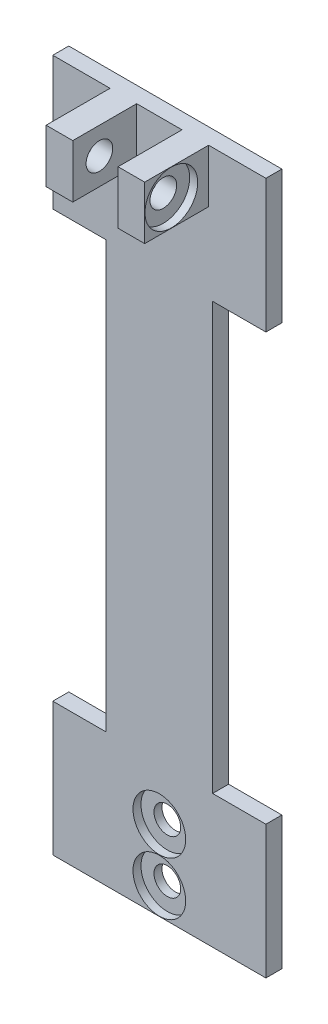
ISO-10303-21;
HEADER;
FILE_DESCRIPTION(('STEP AP214'),'2;1');
FILE_NAME('part.step','',(''),(''),'','','');
FILE_SCHEMA(('AUTOMOTIVE_DESIGN { 1 0 10303 214 1 1 1 1 }'));
ENDSEC;
DATA;
#1=APPLICATION_CONTEXT('core data for automotive mechanical design processes');
#2=APPLICATION_PROTOCOL_DEFINITION('international standard','automotive_design',2000,#1);
#3=PRODUCT_CONTEXT('',#1,'mechanical');
#4=PRODUCT('Part','Part','',(#3));
#5=PRODUCT_RELATED_PRODUCT_CATEGORY('part','',(#4));
#6=PRODUCT_DEFINITION_FORMATION('','',#4);
#7=PRODUCT_DEFINITION_CONTEXT('part definition',#1,'design');
#8=PRODUCT_DEFINITION('design','',#6,#7);
#9=PRODUCT_DEFINITION_SHAPE('','',#8);
#10=(LENGTH_UNIT() NAMED_UNIT(*) SI_UNIT(.MILLI.,.METRE.));
#11=(NAMED_UNIT(*) PLANE_ANGLE_UNIT() SI_UNIT($,.RADIAN.));
#12=(NAMED_UNIT(*) SI_UNIT($,.STERADIAN.) SOLID_ANGLE_UNIT());
#13=UNCERTAINTY_MEASURE_WITH_UNIT(LENGTH_MEASURE(1.E-05),#10,'distance_accuracy_value','');
#14=(GEOMETRIC_REPRESENTATION_CONTEXT(3) GLOBAL_UNCERTAINTY_ASSIGNED_CONTEXT((#13)) GLOBAL_UNIT_ASSIGNED_CONTEXT((#10,
#11,#12)) REPRESENTATION_CONTEXT('',''));
#15=CARTESIAN_POINT('',(0.,0.,0.));
#16=DIRECTION('',(0.,0.,1.));
#17=DIRECTION('',(1.,0.,0.));
#18=AXIS2_PLACEMENT_3D('',#15,#16,#17);
#19=CARTESIAN_POINT('',(0.,0.,3.));
#20=DIRECTION('',(0.,0.,1.));
#21=DIRECTION('',(1.,0.,0.));
#22=AXIS2_PLACEMENT_3D('',#19,#20,#21);
#23=PLANE('',#22);
#24=CARTESIAN_POINT('',(-14.0258823100703,-9.69647058823528,3.));
#25=DIRECTION('',(0.,0.,1.));
#26=DIRECTION('',(1.,0.,0.));
#27=AXIS2_PLACEMENT_3D('',#24,#25,#26);
#28=CIRCLE('',#27,4.95);
#29=CARTESIAN_POINT('',(-9.07588231007033,-9.69647058823528,3.));
#30=VERTEX_POINT('',#29);
#31=EDGE_CURVE('E275',#30,#30,#28,.T.);
#32=ORIENTED_EDGE('',*,*,#31,.F.);
#33=EDGE_LOOP('',(#32));
#34=FACE_BOUND('',#33,.T.);
#35=CARTESIAN_POINT('',(-14.0258823100703,0.303529411764716,3.));
#36=DIRECTION('',(0.,0.,1.));
#37=DIRECTION('',(1.,0.,0.));
#38=AXIS2_PLACEMENT_3D('',#35,#36,#37);
#39=CIRCLE('',#38,4.95);
#40=CARTESIAN_POINT('',(-9.07588231007033,0.303529411764716,3.));
#41=VERTEX_POINT('',#40);
#42=EDGE_CURVE('E278',#41,#41,#39,.T.);
#43=ORIENTED_EDGE('',*,*,#42,.F.);
#44=EDGE_LOOP('',(#43));
#45=FACE_BOUND('',#44,.T.);
#46=DIRECTION('',(1.,0.,0.));
#47=VECTOR('',#46,1.);
#48=CARTESIAN_POINT('',(0.,115.303529411765,3.));
#49=LINE('',#48,#47);
#50=CARTESIAN_POINT('',(-18.2758823100703,115.303529411765,3.));
#51=VERTEX_POINT('',#50);
#52=CARTESIAN_POINT('',(-9.7758823100703,115.303529411765,3.));
#53=VERTEX_POINT('',#52);
#54=EDGE_CURVE('E56',#51,#53,#49,.T.);
#55=ORIENTED_EDGE('',*,*,#54,.F.);
#56=DIRECTION('',(0.,-1.,0.));
#57=VECTOR('',#56,1.);
#58=CARTESIAN_POINT('',(-18.2758823100703,0.,3.));
#59=LINE('',#58,#57);
#60=CARTESIAN_POINT('',(-18.2758823100703,105.303529411765,3.));
#61=VERTEX_POINT('',#60);
#62=EDGE_CURVE('E201',#51,#61,#59,.T.);
#63=ORIENTED_EDGE('',*,*,#62,.T.);
#64=DIRECTION('',(1.,0.,0.));
#65=VECTOR('',#64,1.);
#66=CARTESIAN_POINT('',(0.,105.303529411765,3.));
#67=LINE('',#66,#65);
#68=CARTESIAN_POINT('',(-23.2758823100703,105.303529411765,3.));
#69=VERTEX_POINT('',#68);
#70=EDGE_CURVE('E50',#69,#61,#67,.T.);
#71=ORIENTED_EDGE('',*,*,#70,.F.);
#72=DIRECTION('',(0.,-1.,0.));
#73=VECTOR('',#72,1.);
#74=CARTESIAN_POINT('',(-23.2758823100703,0.,3.));
#75=LINE('',#74,#73);
#76=CARTESIAN_POINT('',(-23.2758823100703,115.303529411765,3.));
#77=VERTEX_POINT('',#76);
#78=EDGE_CURVE('E199',#77,#69,#75,.T.);
#79=ORIENTED_EDGE('',*,*,#78,.F.);
#80=CARTESIAN_POINT('',(-34.0258823100703,115.303529411765,3.));
#81=VERTEX_POINT('',#80);
#82=EDGE_CURVE('E252',#81,#77,#49,.T.);
#83=ORIENTED_EDGE('',*,*,#82,.F.);
#84=DIRECTION('',(0.,-1.,0.));
#85=VECTOR('',#84,1.);
#86=CARTESIAN_POINT('',(-34.0258823100703,0.,3.));
#87=LINE('',#86,#85);
#88=CARTESIAN_POINT('',(-34.0258823100703,90.3035294117647,3.));
#89=VERTEX_POINT('',#88);
#90=EDGE_CURVE('E255',#81,#89,#87,.T.);
#91=ORIENTED_EDGE('',*,*,#90,.T.);
#92=DIRECTION('',(1.,0.,0.));
#93=VECTOR('',#92,1.);
#94=CARTESIAN_POINT('',(0.,90.3035294117647,3.));
#95=LINE('',#94,#93);
#96=CARTESIAN_POINT('',(-24.0258823100703,90.3035294117647,3.));
#97=VERTEX_POINT('',#96);
#98=EDGE_CURVE('E257',#89,#97,#95,.T.);
#99=ORIENTED_EDGE('',*,*,#98,.T.);
#100=DIRECTION('',(0.,-1.,0.));
#101=VECTOR('',#100,1.);
#102=CARTESIAN_POINT('',(-24.0258823100703,0.,3.));
#103=LINE('',#102,#101);
#104=CARTESIAN_POINT('',(-24.0258823100703,10.3035294117647,3.));
#105=VERTEX_POINT('',#104);
#106=EDGE_CURVE('E260',#97,#105,#103,.T.);
#107=ORIENTED_EDGE('',*,*,#106,.T.);
#108=DIRECTION('',(1.,0.,0.));
#109=VECTOR('',#108,1.);
#110=CARTESIAN_POINT('',(0.,10.3035294117647,3.));
#111=LINE('',#110,#109);
#112=CARTESIAN_POINT('',(-34.0258823100703,10.3035294117647,3.));
#113=VERTEX_POINT('',#112);
#114=EDGE_CURVE('E262',#113,#105,#111,.T.);
#115=ORIENTED_EDGE('',*,*,#114,.F.);
#116=CARTESIAN_POINT('',(-34.0258823100703,-14.6964705882353,3.));
#117=VERTEX_POINT('',#116);
#118=EDGE_CURVE('E258',#113,#117,#87,.T.);
#119=ORIENTED_EDGE('',*,*,#118,.T.);
#120=DIRECTION('',(1.,0.,0.));
#121=VECTOR('',#120,1.);
#122=CARTESIAN_POINT('',(0.,-14.6964705882353,3.));
#123=LINE('',#122,#121);
#124=CARTESIAN_POINT('',(5.97411768992968,-14.6964705882353,3.));
#125=VERTEX_POINT('',#124);
#126=EDGE_CURVE('E265',#117,#125,#123,.T.);
#127=ORIENTED_EDGE('',*,*,#126,.T.);
#128=DIRECTION('',(0.,-1.,0.));
#129=VECTOR('',#128,1.);
#130=CARTESIAN_POINT('',(5.97411768992969,0.,3.));
#131=LINE('',#130,#129);
#132=CARTESIAN_POINT('',(5.97411768992969,10.3035294117648,3.));
#133=VERTEX_POINT('',#132);
#134=EDGE_CURVE('E251',#133,#125,#131,.T.);
#135=ORIENTED_EDGE('',*,*,#134,.F.);
#136=DIRECTION('',(-1.,0.,0.));
#137=VECTOR('',#136,1.);
#138=CARTESIAN_POINT('',(0.,10.3035294117648,3.));
#139=LINE('',#138,#137);
#140=CARTESIAN_POINT('',(-4.02588231007036,10.3035294117648,3.));
#141=VERTEX_POINT('',#140);
#142=EDGE_CURVE('E267',#133,#141,#139,.T.);
#143=ORIENTED_EDGE('',*,*,#142,.T.);
#144=DIRECTION('',(0.,-1.,0.));
#145=VECTOR('',#144,1.);
#146=CARTESIAN_POINT('',(-4.02588231007037,0.,3.));
#147=LINE('',#146,#145);
#148=CARTESIAN_POINT('',(-4.0258823100703,90.3035294117647,3.));
#149=VERTEX_POINT('',#148);
#150=EDGE_CURVE('E269',#149,#141,#147,.T.);
#151=ORIENTED_EDGE('',*,*,#150,.F.);
#152=DIRECTION('',(-1.,0.,0.));
#153=VECTOR('',#152,1.);
#154=CARTESIAN_POINT('',(0.,90.3035294117647,3.));
#155=LINE('',#154,#153);
#156=CARTESIAN_POINT('',(5.97411768992969,90.3035294117647,3.));
#157=VERTEX_POINT('',#156);
#158=EDGE_CURVE('E272',#157,#149,#155,.T.);
#159=ORIENTED_EDGE('',*,*,#158,.F.);
#160=CARTESIAN_POINT('',(5.9741176899297,115.303529411765,3.));
#161=VERTEX_POINT('',#160);
#162=EDGE_CURVE('E246',#161,#157,#131,.T.);
#163=ORIENTED_EDGE('',*,*,#162,.F.);
#164=CARTESIAN_POINT('',(-4.7758823100703,115.303529411765,3.));
#165=VERTEX_POINT('',#164);
#166=EDGE_CURVE('E249',#165,#161,#49,.T.);
#167=ORIENTED_EDGE('',*,*,#166,.F.);
#168=DIRECTION('',(0.,-1.,0.));
#169=VECTOR('',#168,1.);
#170=CARTESIAN_POINT('',(-4.7758823100703,0.,3.));
#171=LINE('',#170,#169);
#172=CARTESIAN_POINT('',(-4.7758823100703,105.303529411765,3.));
#173=VERTEX_POINT('',#172);
#174=EDGE_CURVE('E227',#165,#173,#171,.T.);
#175=ORIENTED_EDGE('',*,*,#174,.T.);
#176=DIRECTION('',(-1.,0.,0.));
#177=VECTOR('',#176,1.);
#178=CARTESIAN_POINT('',(0.,105.303529411765,3.));
#179=LINE('',#178,#177);
#180=CARTESIAN_POINT('',(-9.7758823100703,105.303529411765,3.));
#181=VERTEX_POINT('',#180);
#182=EDGE_CURVE('E230',#173,#181,#179,.T.);
#183=ORIENTED_EDGE('',*,*,#182,.T.);
#184=DIRECTION('',(0.,1.,0.));
#185=VECTOR('',#184,1.);
#186=CARTESIAN_POINT('',(-9.7758823100703,0.,3.));
#187=LINE('',#186,#185);
#188=EDGE_CURVE('E225',#181,#53,#187,.T.);
#189=ORIENTED_EDGE('',*,*,#188,.T.);
#190=EDGE_LOOP('',(#55,#63,#71,#79,#83,#91,#99,#107,#115,#119,#127,#135,#143,#151,#159,#163,
#167,#175,#183,#189));
#191=FACE_BOUND('',#190,.T.);
#192=ADVANCED_FACE('F35',(#34,#45,#191),#23,.T.);
#193=CARTESIAN_POINT('',(5.97411768992969,0.,3.));
#194=DIRECTION('',(1.,0.,0.));
#195=DIRECTION('',(0.,1.,0.));
#196=AXIS2_PLACEMENT_3D('',#193,#194,#195);
#197=PLANE('',#196);
#198=DIRECTION('',(0.,-1.,0.));
#199=VECTOR('',#198,1.);
#200=CARTESIAN_POINT('',(5.97411768992969,0.,0.));
#201=LINE('',#200,#199);
#202=CARTESIAN_POINT('',(5.9741176899297,115.303529411765,0.));
#203=VERTEX_POINT('',#202);
#204=CARTESIAN_POINT('',(5.97411768992969,90.3035294117647,0.));
#205=VERTEX_POINT('',#204);
#206=EDGE_CURVE('E243',#203,#205,#201,.T.);
#207=ORIENTED_EDGE('',*,*,#206,.F.);
#208=DIRECTION('',(0.,0.,-1.));
#209=VECTOR('',#208,1.);
#210=CARTESIAN_POINT('',(5.9741176899297,115.303529411765,3.));
#211=LINE('',#210,#209);
#212=EDGE_CURVE('E333',#161,#203,#211,.T.);
#213=ORIENTED_EDGE('',*,*,#212,.F.);
#214=ORIENTED_EDGE('',*,*,#162,.T.);
#215=DIRECTION('',(0.,0.,-1.));
#216=VECTOR('',#215,1.);
#217=CARTESIAN_POINT('',(5.97411768992969,90.3035294117647,3.));
#218=LINE('',#217,#216);
#219=EDGE_CURVE('E281',#157,#205,#218,.T.);
#220=ORIENTED_EDGE('',*,*,#219,.T.);
#221=EDGE_LOOP('',(#207,#213,#214,#220));
#222=FACE_BOUND('',#221,.T.);
#223=ADVANCED_FACE('F349',(#222),#197,.T.);
#224=CARTESIAN_POINT('',(0.,115.303529411765,3.));
#225=DIRECTION('',(0.,1.,0.));
#226=DIRECTION('',(0.,0.,1.));
#227=AXIS2_PLACEMENT_3D('',#224,#225,#226);
#228=PLANE('',#227);
#229=ORIENTED_EDGE('',*,*,#82,.T.);
#230=DIRECTION('',(0.,0.,-1.));
#231=VECTOR('',#230,1.);
#232=CARTESIAN_POINT('',(-23.2758823100703,115.303529411765,15.));
#233=LINE('',#232,#231);
#234=CARTESIAN_POINT('',(-23.2758823100703,115.303529411765,15.));
#235=VERTEX_POINT('',#234);
#236=EDGE_CURVE('E745',#235,#77,#233,.T.);
#237=ORIENTED_EDGE('',*,*,#236,.F.);
#238=DIRECTION('',(-1.,0.,0.));
#239=VECTOR('',#238,1.);
#240=CARTESIAN_POINT('',(-18.2758823100703,115.303529411765,15.));
#241=LINE('',#240,#239);
#242=CARTESIAN_POINT('',(-18.2758823100703,115.303529411765,15.));
#243=VERTEX_POINT('',#242);
#244=EDGE_CURVE('E187',#243,#235,#241,.T.);
#245=ORIENTED_EDGE('',*,*,#244,.F.);
#246=DIRECTION('',(0.,0.,-1.));
#247=VECTOR('',#246,1.);
#248=CARTESIAN_POINT('',(-18.2758823100703,115.303529411765,15.));
#249=LINE('',#248,#247);
#250=EDGE_CURVE('E185',#243,#51,#249,.T.);
#251=ORIENTED_EDGE('',*,*,#250,.T.);
#252=ORIENTED_EDGE('',*,*,#54,.T.);
#253=DIRECTION('',(0.,0.,-1.));
#254=VECTOR('',#253,1.);
#255=CARTESIAN_POINT('',(-9.7758823100703,115.303529411765,15.));
#256=LINE('',#255,#254);
#257=CARTESIAN_POINT('',(-9.7758823100703,115.303529411765,15.));
#258=VERTEX_POINT('',#257);
#259=EDGE_CURVE('E216',#258,#53,#256,.T.);
#260=ORIENTED_EDGE('',*,*,#259,.F.);
#261=DIRECTION('',(1.,0.,0.));
#262=VECTOR('',#261,1.);
#263=CARTESIAN_POINT('',(0.,115.303529411765,15.));
#264=LINE('',#263,#262);
#265=CARTESIAN_POINT('',(-4.7758823100703,115.303529411765,15.));
#266=VERTEX_POINT('',#265);
#267=EDGE_CURVE('E208',#258,#266,#264,.T.);
#268=ORIENTED_EDGE('',*,*,#267,.T.);
#269=DIRECTION('',(0.,0.,-1.));
#270=VECTOR('',#269,1.);
#271=CARTESIAN_POINT('',(-4.7758823100703,115.303529411765,15.));
#272=LINE('',#271,#270);
#273=EDGE_CURVE('E219',#266,#165,#272,.T.);
#274=ORIENTED_EDGE('',*,*,#273,.T.);
#275=ORIENTED_EDGE('',*,*,#166,.T.);
#276=ORIENTED_EDGE('',*,*,#212,.T.);
#277=DIRECTION('',(1.,0.,0.));
#278=VECTOR('',#277,1.);
#279=CARTESIAN_POINT('',(0.,115.303529411765,0.));
#280=LINE('',#279,#278);
#281=CARTESIAN_POINT('',(-34.0258823100703,115.303529411765,0.));
#282=VERTEX_POINT('',#281);
#283=EDGE_CURVE('E284',#282,#203,#280,.T.);
#284=ORIENTED_EDGE('',*,*,#283,.F.);
#285=DIRECTION('',(0.,0.,-1.));
#286=VECTOR('',#285,1.);
#287=CARTESIAN_POINT('',(-34.0258823100703,115.303529411765,3.));
#288=LINE('',#287,#286);
#289=EDGE_CURVE('E331',#81,#282,#288,.T.);
#290=ORIENTED_EDGE('',*,*,#289,.F.);
#291=EDGE_LOOP('',(#229,#237,#245,#251,#252,#260,#268,#274,#275,#276,#284,#290));
#292=FACE_BOUND('',#291,.T.);
#293=ADVANCED_FACE('F37',(#292),#228,.T.);
#294=CARTESIAN_POINT('',(-34.0258823100703,0.,3.));
#295=DIRECTION('',(1.,0.,0.));
#296=DIRECTION('',(0.,1.,0.));
#297=AXIS2_PLACEMENT_3D('',#294,#295,#296);
#298=PLANE('',#297);
#299=DIRECTION('',(0.,-1.,0.));
#300=VECTOR('',#299,1.);
#301=CARTESIAN_POINT('',(-34.0258823100703,0.,0.));
#302=LINE('',#301,#300);
#303=CARTESIAN_POINT('',(-34.0258823100703,90.3035294117647,0.));
#304=VERTEX_POINT('',#303);
#305=EDGE_CURVE('E287',#282,#304,#302,.T.);
#306=ORIENTED_EDGE('',*,*,#305,.T.);
#307=DIRECTION('',(0.,0.,-1.));
#308=VECTOR('',#307,1.);
#309=CARTESIAN_POINT('',(-34.0258823100703,90.3035294117647,3.));
#310=LINE('',#309,#308);
#311=EDGE_CURVE('E328',#89,#304,#310,.T.);
#312=ORIENTED_EDGE('',*,*,#311,.F.);
#313=ORIENTED_EDGE('',*,*,#90,.F.);
#314=ORIENTED_EDGE('',*,*,#289,.T.);
#315=EDGE_LOOP('',(#306,#312,#313,#314));
#316=FACE_BOUND('',#315,.T.);
#317=ADVANCED_FACE('F392',(#316),#298,.F.);
#318=CARTESIAN_POINT('',(0.,90.3035294117647,3.));
#319=DIRECTION('',(0.,1.,0.));
#320=DIRECTION('',(0.,0.,1.));
#321=AXIS2_PLACEMENT_3D('',#318,#319,#320);
#322=PLANE('',#321);
#323=DIRECTION('',(1.,0.,0.));
#324=VECTOR('',#323,1.);
#325=CARTESIAN_POINT('',(0.,90.3035294117647,0.));
#326=LINE('',#325,#324);
#327=CARTESIAN_POINT('',(-24.0258823100703,90.3035294117647,0.));
#328=VERTEX_POINT('',#327);
#329=EDGE_CURVE('E289',#304,#328,#326,.T.);
#330=ORIENTED_EDGE('',*,*,#329,.T.);
#331=DIRECTION('',(0.,0.,-1.));
#332=VECTOR('',#331,1.);
#333=CARTESIAN_POINT('',(-24.0258823100703,90.3035294117647,3.));
#334=LINE('',#333,#332);
#335=EDGE_CURVE('E325',#97,#328,#334,.T.);
#336=ORIENTED_EDGE('',*,*,#335,.F.);
#337=ORIENTED_EDGE('',*,*,#98,.F.);
#338=ORIENTED_EDGE('',*,*,#311,.T.);
#339=EDGE_LOOP('',(#330,#336,#337,#338));
#340=FACE_BOUND('',#339,.T.);
#341=ADVANCED_FACE('F398',(#340),#322,.F.);
#342=CARTESIAN_POINT('',(-24.0258823100703,0.,3.));
#343=DIRECTION('',(1.,0.,0.));
#344=DIRECTION('',(0.,1.,0.));
#345=AXIS2_PLACEMENT_3D('',#342,#343,#344);
#346=PLANE('',#345);
#347=DIRECTION('',(0.,-1.,0.));
#348=VECTOR('',#347,1.);
#349=CARTESIAN_POINT('',(-24.0258823100703,0.,0.));
#350=LINE('',#349,#348);
#351=CARTESIAN_POINT('',(-24.0258823100703,10.3035294117647,0.));
#352=VERTEX_POINT('',#351);
#353=EDGE_CURVE('E292',#328,#352,#350,.T.);
#354=ORIENTED_EDGE('',*,*,#353,.T.);
#355=DIRECTION('',(0.,0.,-1.));
#356=VECTOR('',#355,1.);
#357=CARTESIAN_POINT('',(-24.0258823100703,10.3035294117647,3.));
#358=LINE('',#357,#356);
#359=EDGE_CURVE('E323',#105,#352,#358,.T.);
#360=ORIENTED_EDGE('',*,*,#359,.F.);
#361=ORIENTED_EDGE('',*,*,#106,.F.);
#362=ORIENTED_EDGE('',*,*,#335,.T.);
#363=EDGE_LOOP('',(#354,#360,#361,#362));
#364=FACE_BOUND('',#363,.T.);
#365=ADVANCED_FACE('F395',(#364),#346,.F.);
#366=CARTESIAN_POINT('',(0.,10.3035294117647,3.));
#367=DIRECTION('',(0.,1.,0.));
#368=DIRECTION('',(-1.,0.,0.));
#369=AXIS2_PLACEMENT_3D('',#366,#367,#368);
#370=PLANE('',#369);
#371=DIRECTION('',(1.,0.,0.));
#372=VECTOR('',#371,1.);
#373=CARTESIAN_POINT('',(0.,10.3035294117647,0.));
#374=LINE('',#373,#372);
#375=CARTESIAN_POINT('',(-34.0258823100703,10.3035294117647,0.));
#376=VERTEX_POINT('',#375);
#377=EDGE_CURVE('E295',#376,#352,#374,.T.);
#378=ORIENTED_EDGE('',*,*,#377,.F.);
#379=DIRECTION('',(0.,0.,-1.));
#380=VECTOR('',#379,1.);
#381=CARTESIAN_POINT('',(-34.0258823100703,10.3035294117647,3.));
#382=LINE('',#381,#380);
#383=EDGE_CURVE('E321',#113,#376,#382,.T.);
#384=ORIENTED_EDGE('',*,*,#383,.F.);
#385=ORIENTED_EDGE('',*,*,#114,.T.);
#386=ORIENTED_EDGE('',*,*,#359,.T.);
#387=EDGE_LOOP('',(#378,#384,#385,#386));
#388=FACE_BOUND('',#387,.T.);
#389=ADVANCED_FACE('F390',(#388),#370,.T.);
#390=CARTESIAN_POINT('',(-34.0258823100703,-14.6964705882353,0.));
#391=VERTEX_POINT('',#390);
#392=EDGE_CURVE('E290',#376,#391,#302,.T.);
#393=ORIENTED_EDGE('',*,*,#392,.T.);
#394=DIRECTION('',(0.,0.,-1.));
#395=VECTOR('',#394,1.);
#396=CARTESIAN_POINT('',(-34.0258823100703,-14.6964705882353,3.));
#397=LINE('',#396,#395);
#398=EDGE_CURVE('E318',#117,#391,#397,.T.);
#399=ORIENTED_EDGE('',*,*,#398,.F.);
#400=ORIENTED_EDGE('',*,*,#118,.F.);
#401=ORIENTED_EDGE('',*,*,#383,.T.);
#402=EDGE_LOOP('',(#393,#399,#400,#401));
#403=FACE_BOUND('',#402,.T.);
#404=ADVANCED_FACE('F386',(#403),#298,.F.);
#405=CARTESIAN_POINT('',(0.,-14.6964705882353,3.));
#406=DIRECTION('',(0.,1.,0.));
#407=DIRECTION('',(0.,0.,1.));
#408=AXIS2_PLACEMENT_3D('',#405,#406,#407);
#409=PLANE('',#408);
#410=DIRECTION('',(1.,0.,0.));
#411=VECTOR('',#410,1.);
#412=CARTESIAN_POINT('',(0.,-14.6964705882353,0.));
#413=LINE('',#412,#411);
#414=CARTESIAN_POINT('',(5.97411768992968,-14.6964705882353,0.));
#415=VERTEX_POINT('',#414);
#416=EDGE_CURVE('E298',#391,#415,#413,.T.);
#417=ORIENTED_EDGE('',*,*,#416,.T.);
#418=DIRECTION('',(0.,0.,-1.));
#419=VECTOR('',#418,1.);
#420=CARTESIAN_POINT('',(5.97411768992968,-14.6964705882353,3.));
#421=LINE('',#420,#419);
#422=EDGE_CURVE('E316',#125,#415,#421,.T.);
#423=ORIENTED_EDGE('',*,*,#422,.F.);
#424=ORIENTED_EDGE('',*,*,#126,.F.);
#425=ORIENTED_EDGE('',*,*,#398,.T.);
#426=EDGE_LOOP('',(#417,#423,#424,#425));
#427=FACE_BOUND('',#426,.T.);
#428=ADVANCED_FACE('F382',(#427),#409,.F.);
#429=CARTESIAN_POINT('',(5.97411768992969,10.3035294117648,0.));
#430=VERTEX_POINT('',#429);
#431=EDGE_CURVE('E285',#430,#415,#201,.T.);
#432=ORIENTED_EDGE('',*,*,#431,.F.);
#433=DIRECTION('',(0.,0.,-1.));
#434=VECTOR('',#433,1.);
#435=CARTESIAN_POINT('',(5.97411768992969,10.3035294117648,3.));
#436=LINE('',#435,#434);
#437=EDGE_CURVE('E314',#133,#430,#436,.T.);
#438=ORIENTED_EDGE('',*,*,#437,.F.);
#439=ORIENTED_EDGE('',*,*,#134,.T.);
#440=ORIENTED_EDGE('',*,*,#422,.T.);
#441=EDGE_LOOP('',(#432,#438,#439,#440));
#442=FACE_BOUND('',#441,.T.);
#443=ADVANCED_FACE('F357',(#442),#197,.T.);
#444=CARTESIAN_POINT('',(0.,10.3035294117648,3.));
#445=DIRECTION('',(0.,-1.,0.));
#446=DIRECTION('',(1.,0.,0.));
#447=AXIS2_PLACEMENT_3D('',#444,#445,#446);
#448=PLANE('',#447);
#449=DIRECTION('',(-1.,0.,0.));
#450=VECTOR('',#449,1.);
#451=CARTESIAN_POINT('',(0.,10.3035294117648,0.));
#452=LINE('',#451,#450);
#453=CARTESIAN_POINT('',(-4.02588231007036,10.3035294117648,0.));
#454=VERTEX_POINT('',#453);
#455=EDGE_CURVE('E301',#430,#454,#452,.T.);
#456=ORIENTED_EDGE('',*,*,#455,.T.);
#457=DIRECTION('',(0.,0.,-1.));
#458=VECTOR('',#457,1.);
#459=CARTESIAN_POINT('',(-4.02588231007036,10.3035294117648,3.));
#460=LINE('',#459,#458);
#461=EDGE_CURVE('E312',#141,#454,#460,.T.);
#462=ORIENTED_EDGE('',*,*,#461,.F.);
#463=ORIENTED_EDGE('',*,*,#142,.F.);
#464=ORIENTED_EDGE('',*,*,#437,.T.);
#465=EDGE_LOOP('',(#456,#462,#463,#464));
#466=FACE_BOUND('',#465,.T.);
#467=ADVANCED_FACE('F376',(#466),#448,.F.);
#468=CARTESIAN_POINT('',(-4.02588231007037,0.,3.));
#469=DIRECTION('',(1.,0.,0.));
#470=DIRECTION('',(0.,1.,0.));
#471=AXIS2_PLACEMENT_3D('',#468,#469,#470);
#472=PLANE('',#471);
#473=DIRECTION('',(0.,-1.,0.));
#474=VECTOR('',#473,1.);
#475=CARTESIAN_POINT('',(-4.02588231007037,0.,0.));
#476=LINE('',#475,#474);
#477=CARTESIAN_POINT('',(-4.0258823100703,90.3035294117647,0.));
#478=VERTEX_POINT('',#477);
#479=EDGE_CURVE('E304',#478,#454,#476,.T.);
#480=ORIENTED_EDGE('',*,*,#479,.F.);
#481=DIRECTION('',(0.,0.,-1.));
#482=VECTOR('',#481,1.);
#483=CARTESIAN_POINT('',(-4.0258823100703,90.3035294117647,3.));
#484=LINE('',#483,#482);
#485=EDGE_CURVE('E310',#149,#478,#484,.T.);
#486=ORIENTED_EDGE('',*,*,#485,.F.);
#487=ORIENTED_EDGE('',*,*,#150,.T.);
#488=ORIENTED_EDGE('',*,*,#461,.T.);
#489=EDGE_LOOP('',(#480,#486,#487,#488));
#490=FACE_BOUND('',#489,.T.);
#491=ADVANCED_FACE('F369',(#490),#472,.T.);
#492=CARTESIAN_POINT('',(-14.0258823100703,-9.69647058823528,3.));
#493=DIRECTION('',(0.,0.,-1.));
#494=DIRECTION('',(-1.,0.,0.));
#495=AXIS2_PLACEMENT_3D('',#492,#493,#494);
#496=CYLINDRICAL_SURFACE('',#495,4.95);
#497=CARTESIAN_POINT('',(-14.0258823100703,-9.69647058823528,1.5));
#498=DIRECTION('',(0.,0.,1.));
#499=DIRECTION('',(1.,0.,0.));
#500=AXIS2_PLACEMENT_3D('',#497,#498,#499);
#501=CIRCLE('',#500,4.95);
#502=CARTESIAN_POINT('',(-9.07588231007033,-9.69647058823528,1.5));
#503=VERTEX_POINT('',#502);
#504=EDGE_CURVE('E11',#503,#503,#501,.T.);
#505=ORIENTED_EDGE('',*,*,#504,.F.);
#506=EDGE_LOOP('',(#505));
#507=FACE_BOUND('',#506,.T.);
#508=ORIENTED_EDGE('',*,*,#31,.T.);
#509=EDGE_LOOP('',(#508));
#510=FACE_BOUND('',#509,.T.);
#511=ADVANCED_FACE('F366',(#507,#510),#496,.F.);
#512=CARTESIAN_POINT('',(0.,90.3035294117647,3.));
#513=DIRECTION('',(0.,-1.,0.));
#514=DIRECTION('',(0.,0.,-1.));
#515=AXIS2_PLACEMENT_3D('',#512,#513,#514);
#516=PLANE('',#515);
#517=DIRECTION('',(-1.,0.,0.));
#518=VECTOR('',#517,1.);
#519=CARTESIAN_POINT('',(0.,90.3035294117647,0.));
#520=LINE('',#519,#518);
#521=EDGE_CURVE('E250',#205,#478,#520,.T.);
#522=ORIENTED_EDGE('',*,*,#521,.F.);
#523=ORIENTED_EDGE('',*,*,#219,.F.);
#524=ORIENTED_EDGE('',*,*,#158,.T.);
#525=ORIENTED_EDGE('',*,*,#485,.T.);
#526=EDGE_LOOP('',(#522,#523,#524,#525));
#527=FACE_BOUND('',#526,.T.);
#528=ADVANCED_FACE('F344',(#527),#516,.T.);
#529=CARTESIAN_POINT('',(-14.0258823100703,0.303529411764716,3.));
#530=DIRECTION('',(0.,0.,-1.));
#531=DIRECTION('',(-1.,0.,0.));
#532=AXIS2_PLACEMENT_3D('',#529,#530,#531);
#533=CYLINDRICAL_SURFACE('',#532,4.95);
#534=CARTESIAN_POINT('',(-14.0258823100703,0.303529411764716,1.5));
#535=DIRECTION('',(0.,0.,1.));
#536=DIRECTION('',(1.,0.,0.));
#537=AXIS2_PLACEMENT_3D('',#534,#535,#536);
#538=CIRCLE('',#537,4.95);
#539=CARTESIAN_POINT('',(-9.07588231007033,0.303529411764716,1.5));
#540=VERTEX_POINT('',#539);
#541=EDGE_CURVE('E43',#540,#540,#538,.T.);
#542=ORIENTED_EDGE('',*,*,#541,.F.);
#543=EDGE_LOOP('',(#542));
#544=FACE_BOUND('',#543,.T.);
#545=ORIENTED_EDGE('',*,*,#42,.T.);
#546=EDGE_LOOP('',(#545));
#547=FACE_BOUND('',#546,.T.);
#548=ADVANCED_FACE('F340',(#544,#547),#533,.F.);
#549=CARTESIAN_POINT('',(0.,0.,0.));
#550=DIRECTION('',(0.,0.,1.));
#551=DIRECTION('',(1.,0.,0.));
#552=AXIS2_PLACEMENT_3D('',#549,#550,#551);
#553=PLANE('',#552);
#554=ORIENTED_EDGE('',*,*,#283,.T.);
#555=ORIENTED_EDGE('',*,*,#206,.T.);
#556=ORIENTED_EDGE('',*,*,#521,.T.);
#557=ORIENTED_EDGE('',*,*,#479,.T.);
#558=ORIENTED_EDGE('',*,*,#455,.F.);
#559=ORIENTED_EDGE('',*,*,#431,.T.);
#560=ORIENTED_EDGE('',*,*,#416,.F.);
#561=ORIENTED_EDGE('',*,*,#392,.F.);
#562=ORIENTED_EDGE('',*,*,#377,.T.);
#563=ORIENTED_EDGE('',*,*,#353,.F.);
#564=ORIENTED_EDGE('',*,*,#329,.F.);
#565=ORIENTED_EDGE('',*,*,#305,.F.);
#566=EDGE_LOOP('',(#554,#555,#556,#557,#558,#559,#560,#561,#562,#563,#564,#565));
#567=FACE_BOUND('',#566,.T.);
#568=CARTESIAN_POINT('',(-14.0258823100703,0.303529411764716,0.));
#569=DIRECTION('',(0.,0.,1.));
#570=DIRECTION('',(1.,0.,0.));
#571=AXIS2_PLACEMENT_3D('',#568,#569,#570);
#572=CIRCLE('',#571,2.5);
#573=CARTESIAN_POINT('',(-11.5258823100703,0.303529411764716,0.));
#574=VERTEX_POINT('',#573);
#575=EDGE_CURVE('E237',#574,#574,#572,.T.);
#576=ORIENTED_EDGE('',*,*,#575,.T.);
#577=EDGE_LOOP('',(#576));
#578=FACE_BOUND('',#577,.T.);
#579=CARTESIAN_POINT('',(-14.0258823100703,-9.69647058823528,0.));
#580=DIRECTION('',(0.,0.,1.));
#581=DIRECTION('',(1.,0.,0.));
#582=AXIS2_PLACEMENT_3D('',#579,#580,#581);
#583=CIRCLE('',#582,2.5);
#584=CARTESIAN_POINT('',(-11.5258823100703,-9.69647058823528,0.));
#585=VERTEX_POINT('',#584);
#586=EDGE_CURVE('E233',#585,#585,#583,.T.);
#587=ORIENTED_EDGE('',*,*,#586,.T.);
#588=EDGE_LOOP('',(#587));
#589=FACE_BOUND('',#588,.T.);
#590=ADVANCED_FACE('F343',(#567,#578,#589),#553,.F.);
#591=CARTESIAN_POINT('',(-14.0258823100703,0.303529411764716,1.5));
#592=DIRECTION('',(0.,0.,-1.));
#593=DIRECTION('',(-1.,0.,0.));
#594=AXIS2_PLACEMENT_3D('',#591,#592,#593);
#595=CYLINDRICAL_SURFACE('',#594,2.5);
#596=CARTESIAN_POINT('',(-14.0258823100703,0.303529411764716,1.5));
#597=DIRECTION('',(0.,0.,1.));
#598=DIRECTION('',(1.,0.,0.));
#599=AXIS2_PLACEMENT_3D('',#596,#597,#598);
#600=CIRCLE('',#599,2.5);
#601=CARTESIAN_POINT('',(-11.5258823100703,0.303529411764716,1.5));
#602=VERTEX_POINT('',#601);
#603=EDGE_CURVE('E240',#602,#602,#600,.T.);
#604=ORIENTED_EDGE('',*,*,#603,.T.);
#605=EDGE_LOOP('',(#604));
#606=FACE_BOUND('',#605,.T.);
#607=ORIENTED_EDGE('',*,*,#575,.F.);
#608=EDGE_LOOP('',(#607));
#609=FACE_BOUND('',#608,.T.);
#610=ADVANCED_FACE('F361',(#606,#609),#595,.F.);
#611=CARTESIAN_POINT('',(0.,0.,1.5));
#612=DIRECTION('',(0.,0.,1.));
#613=DIRECTION('',(1.,0.,0.));
#614=AXIS2_PLACEMENT_3D('',#611,#612,#613);
#615=PLANE('',#614);
#616=ORIENTED_EDGE('',*,*,#603,.F.);
#617=EDGE_LOOP('',(#616));
#618=FACE_BOUND('',#617,.T.);
#619=ORIENTED_EDGE('',*,*,#541,.T.);
#620=EDGE_LOOP('',(#619));
#621=FACE_BOUND('',#620,.T.);
#622=ADVANCED_FACE('F338',(#618,#621),#615,.T.);
#623=CARTESIAN_POINT('',(-14.0258823100703,-9.69647058823528,1.5));
#624=DIRECTION('',(0.,0.,-1.));
#625=DIRECTION('',(-1.,0.,0.));
#626=AXIS2_PLACEMENT_3D('',#623,#624,#625);
#627=CYLINDRICAL_SURFACE('',#626,2.5);
#628=CARTESIAN_POINT('',(-14.0258823100703,-9.69647058823528,1.5));
#629=DIRECTION('',(0.,0.,1.));
#630=DIRECTION('',(1.,0.,0.));
#631=AXIS2_PLACEMENT_3D('',#628,#629,#630);
#632=CIRCLE('',#631,2.5);
#633=CARTESIAN_POINT('',(-11.5258823100703,-9.69647058823528,1.5));
#634=VERTEX_POINT('',#633);
#635=EDGE_CURVE('E234',#634,#634,#632,.T.);
#636=ORIENTED_EDGE('',*,*,#635,.T.);
#637=EDGE_LOOP('',(#636));
#638=FACE_BOUND('',#637,.T.);
#639=ORIENTED_EDGE('',*,*,#586,.F.);
#640=EDGE_LOOP('',(#639));
#641=FACE_BOUND('',#640,.T.);
#642=ADVANCED_FACE('F478',(#638,#641),#627,.F.);
#643=CARTESIAN_POINT('',(0.,0.,1.5));
#644=DIRECTION('',(0.,0.,1.));
#645=DIRECTION('',(1.,0.,0.));
#646=AXIS2_PLACEMENT_3D('',#643,#644,#645);
#647=PLANE('',#646);
#648=ORIENTED_EDGE('',*,*,#635,.F.);
#649=EDGE_LOOP('',(#648));
#650=FACE_BOUND('',#649,.T.);
#651=ORIENTED_EDGE('',*,*,#504,.T.);
#652=EDGE_LOOP('',(#651));
#653=FACE_BOUND('',#652,.T.);
#654=ADVANCED_FACE('F475',(#650,#653),#647,.T.);
#655=CARTESIAN_POINT('',(0.,105.303529411765,15.));
#656=DIRECTION('',(0.,1.,0.));
#657=DIRECTION('',(0.,0.,1.));
#658=AXIS2_PLACEMENT_3D('',#655,#656,#657);
#659=PLANE('',#658);
#660=ORIENTED_EDGE('',*,*,#182,.F.);
#661=DIRECTION('',(0.,0.,-1.));
#662=VECTOR('',#661,1.);
#663=CARTESIAN_POINT('',(-4.7758823100703,105.303529411765,15.));
#664=LINE('',#663,#662);
#665=CARTESIAN_POINT('',(-4.7758823100703,105.303529411765,15.));
#666=VERTEX_POINT('',#665);
#667=EDGE_CURVE('E222',#666,#173,#664,.T.);
#668=ORIENTED_EDGE('',*,*,#667,.F.);
#669=DIRECTION('',(1.,0.,0.));
#670=VECTOR('',#669,1.);
#671=CARTESIAN_POINT('',(0.,105.303529411765,15.));
#672=LINE('',#671,#670);
#673=CARTESIAN_POINT('',(-9.7758823100703,105.303529411765,15.));
#674=VERTEX_POINT('',#673);
#675=EDGE_CURVE('E203',#674,#666,#672,.T.);
#676=ORIENTED_EDGE('',*,*,#675,.F.);
#677=DIRECTION('',(0.,0.,-1.));
#678=VECTOR('',#677,1.);
#679=CARTESIAN_POINT('',(-9.7758823100703,105.303529411765,15.));
#680=LINE('',#679,#678);
#681=EDGE_CURVE('E213',#674,#181,#680,.T.);
#682=ORIENTED_EDGE('',*,*,#681,.T.);
#683=EDGE_LOOP('',(#660,#668,#676,#682));
#684=FACE_BOUND('',#683,.T.);
#685=ADVANCED_FACE('F449',(#684),#659,.F.);
#686=CARTESIAN_POINT('',(-4.7758823100703,0.,15.));
#687=DIRECTION('',(-1.,0.,0.));
#688=DIRECTION('',(0.,0.,1.));
#689=AXIS2_PLACEMENT_3D('',#686,#687,#688);
#690=PLANE('',#689);
#691=CARTESIAN_POINT('',(-4.7758823100703,110.303529411765,10.));
#692=DIRECTION('',(1.,0.,0.));
#693=DIRECTION('',(0.,0.,-1.));
#694=AXIS2_PLACEMENT_3D('',#691,#692,#693);
#695=CIRCLE('',#694,4.94999999999999);
#696=CARTESIAN_POINT('',(-4.7758823100703,110.303529411765,5.05000000000001));
#697=VERTEX_POINT('',#696);
#698=EDGE_CURVE('E750',#697,#697,#695,.T.);
#699=ORIENTED_EDGE('',*,*,#698,.F.);
#700=EDGE_LOOP('',(#699));
#701=FACE_BOUND('',#700,.T.);
#702=ORIENTED_EDGE('',*,*,#174,.F.);
#703=ORIENTED_EDGE('',*,*,#273,.F.);
#704=DIRECTION('',(0.,1.,0.));
#705=VECTOR('',#704,1.);
#706=CARTESIAN_POINT('',(-4.7758823100703,0.,15.));
#707=LINE('',#706,#705);
#708=EDGE_CURVE('E206',#666,#266,#707,.T.);
#709=ORIENTED_EDGE('',*,*,#708,.F.);
#710=ORIENTED_EDGE('',*,*,#667,.T.);
#711=EDGE_LOOP('',(#702,#703,#709,#710));
#712=FACE_BOUND('',#711,.T.);
#713=ADVANCED_FACE('F452',(#701,#712),#690,.F.);
#714=CARTESIAN_POINT('',(-9.7758823100703,0.,15.));
#715=DIRECTION('',(1.,0.,0.));
#716=DIRECTION('',(0.,0.,-1.));
#717=AXIS2_PLACEMENT_3D('',#714,#715,#716);
#718=PLANE('',#717);
#719=CARTESIAN_POINT('',(-9.7758823100703,110.303529411765,10.));
#720=DIRECTION('',(1.,0.,0.));
#721=DIRECTION('',(0.,0.,-1.));
#722=AXIS2_PLACEMENT_3D('',#719,#720,#721);
#723=CIRCLE('',#722,2.5);
#724=CARTESIAN_POINT('',(-9.7758823100703,110.303529411765,7.5));
#725=VERTEX_POINT('',#724);
#726=EDGE_CURVE('E757',#725,#725,#723,.T.);
#727=ORIENTED_EDGE('',*,*,#726,.T.);
#728=EDGE_LOOP('',(#727));
#729=FACE_BOUND('',#728,.T.);
#730=ORIENTED_EDGE('',*,*,#188,.F.);
#731=ORIENTED_EDGE('',*,*,#681,.F.);
#732=DIRECTION('',(0.,-1.,0.));
#733=VECTOR('',#732,1.);
#734=CARTESIAN_POINT('',(-9.7758823100703,0.,15.));
#735=LINE('',#734,#733);
#736=EDGE_CURVE('E211',#258,#674,#735,.T.);
#737=ORIENTED_EDGE('',*,*,#736,.F.);
#738=ORIENTED_EDGE('',*,*,#259,.T.);
#739=EDGE_LOOP('',(#730,#731,#737,#738));
#740=FACE_BOUND('',#739,.T.);
#741=ADVANCED_FACE('F444',(#729,#740),#718,.F.);
#742=CARTESIAN_POINT('',(0.,0.,15.));
#743=DIRECTION('',(0.,0.,1.));
#744=DIRECTION('',(1.,0.,0.));
#745=AXIS2_PLACEMENT_3D('',#742,#743,#744);
#746=PLANE('',#745);
#747=ORIENTED_EDGE('',*,*,#675,.T.);
#748=ORIENTED_EDGE('',*,*,#708,.T.);
#749=ORIENTED_EDGE('',*,*,#267,.F.);
#750=ORIENTED_EDGE('',*,*,#736,.T.);
#751=EDGE_LOOP('',(#747,#748,#749,#750));
#752=FACE_BOUND('',#751,.T.);
#753=ADVANCED_FACE('F455',(#752),#746,.T.);
#754=CARTESIAN_POINT('',(-18.2758823100703,105.303529411765,15.));
#755=DIRECTION('',(-1.,0.,0.));
#756=DIRECTION('',(0.,0.,1.));
#757=AXIS2_PLACEMENT_3D('',#754,#755,#756);
#758=PLANE('',#757);
#759=CARTESIAN_POINT('',(-18.2758823100703,110.303529411765,10.));
#760=DIRECTION('',(-1.,0.,0.));
#761=DIRECTION('',(0.,0.,1.));
#762=AXIS2_PLACEMENT_3D('',#759,#760,#761);
#763=CIRCLE('',#762,2.5);
#764=CARTESIAN_POINT('',(-18.2758823100703,110.303529411765,12.5));
#765=VERTEX_POINT('',#764);
#766=EDGE_CURVE('E762',#765,#765,#763,.T.);
#767=ORIENTED_EDGE('',*,*,#766,.T.);
#768=EDGE_LOOP('',(#767));
#769=FACE_BOUND('',#768,.T.);
#770=ORIENTED_EDGE('',*,*,#62,.F.);
#771=ORIENTED_EDGE('',*,*,#250,.F.);
#772=DIRECTION('',(0.,1.,0.));
#773=VECTOR('',#772,1.);
#774=CARTESIAN_POINT('',(-18.2758823100703,105.303529411765,15.));
#775=LINE('',#774,#773);
#776=CARTESIAN_POINT('',(-18.2758823100703,105.303529411765,15.));
#777=VERTEX_POINT('',#776);
#778=EDGE_CURVE('E182',#777,#243,#775,.T.);
#779=ORIENTED_EDGE('',*,*,#778,.F.);
#780=DIRECTION('',(0.,0.,-1.));
#781=VECTOR('',#780,1.);
#782=CARTESIAN_POINT('',(-18.2758823100703,105.303529411765,15.));
#783=LINE('',#782,#781);
#784=EDGE_CURVE('E171',#777,#61,#783,.T.);
#785=ORIENTED_EDGE('',*,*,#784,.T.);
#786=EDGE_LOOP('',(#770,#771,#779,#785));
#787=FACE_BOUND('',#786,.T.);
#788=ADVANCED_FACE('F183',(#769,#787),#758,.F.);
#789=CARTESIAN_POINT('',(-23.2758823100703,105.303529411765,15.));
#790=DIRECTION('',(-1.,0.,0.));
#791=DIRECTION('',(0.,-1.,0.));
#792=AXIS2_PLACEMENT_3D('',#789,#790,#791);
#793=PLANE('',#792);
#794=CARTESIAN_POINT('',(-23.2758823100703,110.303529411765,10.));
#795=DIRECTION('',(-1.,0.,0.));
#796=DIRECTION('',(0.,-1.,0.));
#797=AXIS2_PLACEMENT_3D('',#794,#795,#796);
#798=CIRCLE('',#797,4.94999999999999);
#799=CARTESIAN_POINT('',(-23.2758823100703,105.353529411765,10.));
#800=VERTEX_POINT('',#799);
#801=EDGE_CURVE('E742',#800,#800,#798,.T.);
#802=ORIENTED_EDGE('',*,*,#801,.F.);
#803=EDGE_LOOP('',(#802));
#804=FACE_BOUND('',#803,.T.);
#805=ORIENTED_EDGE('',*,*,#236,.T.);
#806=ORIENTED_EDGE('',*,*,#78,.T.);
#807=DIRECTION('',(0.,0.,-1.));
#808=VECTOR('',#807,1.);
#809=CARTESIAN_POINT('',(-23.2758823100703,105.303529411765,15.));
#810=LINE('',#809,#808);
#811=CARTESIAN_POINT('',(-23.2758823100703,105.303529411765,15.));
#812=VERTEX_POINT('',#811);
#813=EDGE_CURVE('E178',#812,#69,#810,.T.);
#814=ORIENTED_EDGE('',*,*,#813,.F.);
#815=DIRECTION('',(0.,1.,0.));
#816=VECTOR('',#815,1.);
#817=CARTESIAN_POINT('',(-23.2758823100703,105.303529411765,15.));
#818=LINE('',#817,#816);
#819=EDGE_CURVE('E192',#812,#235,#818,.T.);
#820=ORIENTED_EDGE('',*,*,#819,.T.);
#821=EDGE_LOOP('',(#805,#806,#814,#820));
#822=FACE_BOUND('',#821,.T.);
#823=ADVANCED_FACE('F462',(#804,#822),#793,.T.);
#824=CARTESIAN_POINT('',(-18.2758823100703,105.303529411765,15.));
#825=DIRECTION('',(0.,-1.,0.));
#826=DIRECTION('',(0.,0.,-1.));
#827=AXIS2_PLACEMENT_3D('',#824,#825,#826);
#828=PLANE('',#827);
#829=ORIENTED_EDGE('',*,*,#813,.T.);
#830=ORIENTED_EDGE('',*,*,#70,.T.);
#831=ORIENTED_EDGE('',*,*,#784,.F.);
#832=DIRECTION('',(-1.,0.,0.));
#833=VECTOR('',#832,1.);
#834=CARTESIAN_POINT('',(-18.2758823100703,105.303529411765,15.));
#835=LINE('',#834,#833);
#836=EDGE_CURVE('E176',#777,#812,#835,.T.);
#837=ORIENTED_EDGE('',*,*,#836,.T.);
#838=EDGE_LOOP('',(#829,#830,#831,#837));
#839=FACE_BOUND('',#838,.T.);
#840=ADVANCED_FACE('F174',(#839),#828,.T.);
#841=CARTESIAN_POINT('',(0.,0.,15.));
#842=DIRECTION('',(0.,0.,1.));
#843=DIRECTION('',(1.,0.,0.));
#844=AXIS2_PLACEMENT_3D('',#841,#842,#843);
#845=PLANE('',#844);
#846=ORIENTED_EDGE('',*,*,#778,.T.);
#847=ORIENTED_EDGE('',*,*,#244,.T.);
#848=ORIENTED_EDGE('',*,*,#819,.F.);
#849=ORIENTED_EDGE('',*,*,#836,.F.);
#850=EDGE_LOOP('',(#846,#847,#848,#849));
#851=FACE_BOUND('',#850,.T.);
#852=ADVANCED_FACE('F190',(#851),#845,.T.);
#853=CARTESIAN_POINT('',(-6.2758823100703,110.303529411765,10.));
#854=DIRECTION('',(1.,0.,0.));
#855=DIRECTION('',(0.,0.,-1.));
#856=AXIS2_PLACEMENT_3D('',#853,#854,#855);
#857=CYLINDRICAL_SURFACE('',#856,4.94999999999999);
#858=CARTESIAN_POINT('',(-6.2758823100703,110.303529411765,10.));
#859=DIRECTION('',(1.,0.,0.));
#860=DIRECTION('',(0.,0.,-1.));
#861=AXIS2_PLACEMENT_3D('',#858,#859,#860);
#862=CIRCLE('',#861,4.94999999999999);
#863=CARTESIAN_POINT('',(-6.2758823100703,110.303529411765,5.05000000000001));
#864=VERTEX_POINT('',#863);
#865=EDGE_CURVE('E747',#864,#864,#862,.T.);
#866=ORIENTED_EDGE('',*,*,#865,.F.);
#867=EDGE_LOOP('',(#866));
#868=FACE_BOUND('',#867,.T.);
#869=ORIENTED_EDGE('',*,*,#698,.T.);
#870=EDGE_LOOP('',(#869));
#871=FACE_BOUND('',#870,.T.);
#872=ADVANCED_FACE('F693',(#868,#871),#857,.F.);
#873=CARTESIAN_POINT('',(-6.2758823100703,110.303529411765,10.));
#874=DIRECTION('',(1.,0.,0.));
#875=DIRECTION('',(0.,0.,-1.));
#876=AXIS2_PLACEMENT_3D('',#873,#874,#875);
#877=PLANE('',#876);
#878=CARTESIAN_POINT('',(-6.2758823100703,110.303529411765,10.));
#879=DIRECTION('',(1.,0.,0.));
#880=DIRECTION('',(0.,0.,-1.));
#881=AXIS2_PLACEMENT_3D('',#878,#879,#880);
#882=CIRCLE('',#881,2.5);
#883=CARTESIAN_POINT('',(-6.2758823100703,110.303529411765,7.5));
#884=VERTEX_POINT('',#883);
#885=EDGE_CURVE('E765',#884,#884,#882,.T.);
#886=ORIENTED_EDGE('',*,*,#885,.F.);
#887=EDGE_LOOP('',(#886));
#888=FACE_BOUND('',#887,.T.);
#889=ORIENTED_EDGE('',*,*,#865,.T.);
#890=EDGE_LOOP('',(#889));
#891=FACE_BOUND('',#890,.T.);
#892=ADVANCED_FACE('F689',(#888,#891),#877,.T.);
#893=CARTESIAN_POINT('',(-21.7758823100703,110.303529411765,10.));
#894=DIRECTION('',(-1.,0.,0.));
#895=DIRECTION('',(0.,0.,1.));
#896=AXIS2_PLACEMENT_3D('',#893,#894,#895);
#897=CYLINDRICAL_SURFACE('',#896,4.94999999999999);
#898=CARTESIAN_POINT('',(-21.7758823100703,110.303529411765,10.));
#899=DIRECTION('',(-1.,0.,0.));
#900=DIRECTION('',(0.,-1.,0.));
#901=AXIS2_PLACEMENT_3D('',#898,#899,#900);
#902=CIRCLE('',#901,4.94999999999999);
#903=CARTESIAN_POINT('',(-21.7758823100703,105.353529411765,10.));
#904=VERTEX_POINT('',#903);
#905=EDGE_CURVE('E753',#904,#904,#902,.T.);
#906=ORIENTED_EDGE('',*,*,#905,.F.);
#907=EDGE_LOOP('',(#906));
#908=FACE_BOUND('',#907,.T.);
#909=ORIENTED_EDGE('',*,*,#801,.T.);
#910=EDGE_LOOP('',(#909));
#911=FACE_BOUND('',#910,.T.);
#912=ADVANCED_FACE('F685',(#908,#911),#897,.F.);
#913=CARTESIAN_POINT('',(-21.7758823100703,110.303529411765,10.));
#914=DIRECTION('',(-1.,0.,0.));
#915=DIRECTION('',(0.,-1.,0.));
#916=AXIS2_PLACEMENT_3D('',#913,#914,#915);
#917=PLANE('',#916);
#918=CARTESIAN_POINT('',(-21.7758823100703,110.303529411765,10.));
#919=DIRECTION('',(-1.,0.,0.));
#920=DIRECTION('',(0.,-1.,0.));
#921=AXIS2_PLACEMENT_3D('',#918,#919,#920);
#922=CIRCLE('',#921,2.5);
#923=CARTESIAN_POINT('',(-21.7758823100703,107.803529411765,10.));
#924=VERTEX_POINT('',#923);
#925=EDGE_CURVE('E767',#924,#924,#922,.T.);
#926=ORIENTED_EDGE('',*,*,#925,.F.);
#927=EDGE_LOOP('',(#926));
#928=FACE_BOUND('',#927,.T.);
#929=ORIENTED_EDGE('',*,*,#905,.T.);
#930=EDGE_LOOP('',(#929));
#931=FACE_BOUND('',#930,.T.);
#932=ADVANCED_FACE('F650',(#928,#931),#917,.T.);
#933=CARTESIAN_POINT('',(-34.0258823100703,110.303529411765,10.));
#934=DIRECTION('',(1.,0.,0.));
#935=DIRECTION('',(0.,0.,-1.));
#936=AXIS2_PLACEMENT_3D('',#933,#934,#935);
#937=CYLINDRICAL_SURFACE('',#936,2.5);
#938=ORIENTED_EDGE('',*,*,#925,.T.);
#939=EDGE_LOOP('',(#938));
#940=FACE_BOUND('',#939,.T.);
#941=ORIENTED_EDGE('',*,*,#766,.F.);
#942=EDGE_LOOP('',(#941));
#943=FACE_BOUND('',#942,.T.);
#944=ADVANCED_FACE('F663',(#940,#943),#937,.F.);
#945=ORIENTED_EDGE('',*,*,#885,.T.);
#946=EDGE_LOOP('',(#945));
#947=FACE_BOUND('',#946,.T.);
#948=ORIENTED_EDGE('',*,*,#726,.F.);
#949=EDGE_LOOP('',(#948));
#950=FACE_BOUND('',#949,.T.);
#951=ADVANCED_FACE('F668',(#947,#950),#937,.F.);
#952=CLOSED_SHELL('',(#192,#223,#293,#317,#341,#365,#389,#404,#428,#443,#467,#491,#511,#528,
#548,#590,#610,#622,#642,#654,#685,#713,#741,#753,#788,#823,#840,#852,#872,#892,#912,#932,#944,#951));
#953=MANIFOLD_SOLID_BREP('B2',#952);
#954=ADVANCED_BREP_SHAPE_REPRESENTATION('',(#18,#953),#14);
#955=SHAPE_DEFINITION_REPRESENTATION(#9,#954);
ENDSEC;
END-ISO-10303-21;
